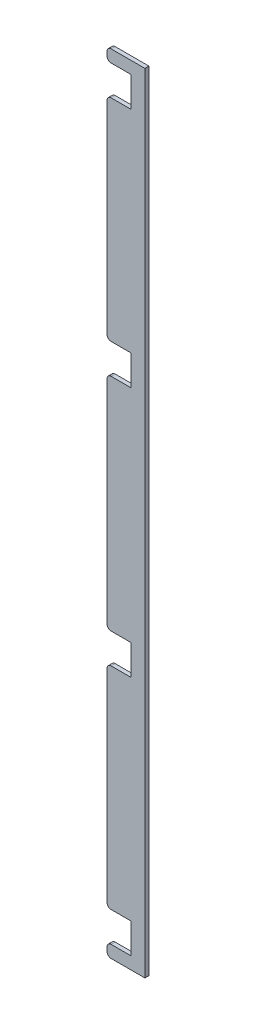
ISO-10303-21;
HEADER;
FILE_DESCRIPTION(('STEP AP214'),'2;1');
FILE_NAME('part.step','',(''),(''),'','','');
FILE_SCHEMA(('AUTOMOTIVE_DESIGN { 1 0 10303 214 1 1 1 1 }'));
ENDSEC;
DATA;
#1=APPLICATION_CONTEXT('core data for automotive mechanical design processes');
#2=APPLICATION_PROTOCOL_DEFINITION('international standard','automotive_design',2000,#1);
#3=PRODUCT_CONTEXT('',#1,'mechanical');
#4=PRODUCT('Part','Part','',(#3));
#5=PRODUCT_RELATED_PRODUCT_CATEGORY('part','',(#4));
#6=PRODUCT_DEFINITION_FORMATION('','',#4);
#7=PRODUCT_DEFINITION_CONTEXT('part definition',#1,'design');
#8=PRODUCT_DEFINITION('design','',#6,#7);
#9=PRODUCT_DEFINITION_SHAPE('','',#8);
#10=(LENGTH_UNIT() NAMED_UNIT(*) SI_UNIT(.MILLI.,.METRE.));
#11=(NAMED_UNIT(*) PLANE_ANGLE_UNIT() SI_UNIT($,.RADIAN.));
#12=(NAMED_UNIT(*) SI_UNIT($,.STERADIAN.) SOLID_ANGLE_UNIT());
#13=UNCERTAINTY_MEASURE_WITH_UNIT(LENGTH_MEASURE(1.E-05),#10,'distance_accuracy_value','');
#14=(GEOMETRIC_REPRESENTATION_CONTEXT(3) GLOBAL_UNCERTAINTY_ASSIGNED_CONTEXT((#13)) GLOBAL_UNIT_ASSIGNED_CONTEXT((#10,
#11,#12)) REPRESENTATION_CONTEXT('',''));
#15=CARTESIAN_POINT('',(0.,0.,0.));
#16=DIRECTION('',(0.,0.,1.));
#17=DIRECTION('',(1.,0.,0.));
#18=AXIS2_PLACEMENT_3D('',#15,#16,#17);
#19=CARTESIAN_POINT('',(-9.40000000000017,0.,1.));
#20=DIRECTION('',(1.,0.,0.));
#21=DIRECTION('',(0.,0.,-1.));
#22=AXIS2_PLACEMENT_3D('',#19,#20,#21);
#23=PLANE('',#22);
#24=DIRECTION('',(0.,-1.,0.));
#25=VECTOR('',#24,1.);
#26=CARTESIAN_POINT('',(-9.40000000000017,0.,0.));
#27=LINE('',#26,#25);
#28=CARTESIAN_POINT('',(-9.40000000000017,12.4047619047619,0.));
#29=VERTEX_POINT('',#28);
#30=CARTESIAN_POINT('',(-9.40000000000017,11.3547619047619,0.));
#31=VERTEX_POINT('',#30);
#32=EDGE_CURVE('E266',#29,#31,#27,.T.);
#33=ORIENTED_EDGE('',*,*,#32,.T.);
#34=DIRECTION('',(0.,0.,-1.));
#35=VECTOR('',#34,1.);
#36=CARTESIAN_POINT('',(-9.40000000000017,11.3547619047619,1.));
#37=LINE('',#36,#35);
#38=CARTESIAN_POINT('',(-9.40000000000017,11.3547619047619,1.));
#39=VERTEX_POINT('',#38);
#40=EDGE_CURVE('E11',#39,#31,#37,.T.);
#41=ORIENTED_EDGE('',*,*,#40,.F.);
#42=DIRECTION('',(0.,-1.,0.));
#43=VECTOR('',#42,1.);
#44=CARTESIAN_POINT('',(-9.40000000000017,0.,1.));
#45=LINE('',#44,#43);
#46=CARTESIAN_POINT('',(-9.40000000000017,12.4047619047619,1.));
#47=VERTEX_POINT('',#46);
#48=EDGE_CURVE('E325',#47,#39,#45,.T.);
#49=ORIENTED_EDGE('',*,*,#48,.F.);
#50=DIRECTION('',(0.,0.,-1.));
#51=VECTOR('',#50,1.);
#52=CARTESIAN_POINT('',(-9.40000000000017,12.4047619047619,1.));
#53=LINE('',#52,#51);
#54=EDGE_CURVE('E265',#47,#29,#53,.T.);
#55=ORIENTED_EDGE('',*,*,#54,.T.);
#56=EDGE_LOOP('',(#33,#41,#49,#55));
#57=FACE_BOUND('',#56,.T.);
#58=ADVANCED_FACE('F37',(#57),#23,.F.);
#59=CARTESIAN_POINT('',(-8.40000000000017,11.3547619047619,1.));
#60=DIRECTION('',(0.,0.,-1.));
#61=DIRECTION('',(-1.,0.,0.));
#62=AXIS2_PLACEMENT_3D('',#59,#60,#61);
#63=CYLINDRICAL_SURFACE('',#62,1.);
#64=CARTESIAN_POINT('',(-8.40000000000017,11.3547619047619,0.));
#65=DIRECTION('',(0.,0.,1.));
#66=DIRECTION('',(1.,0.,0.));
#67=AXIS2_PLACEMENT_3D('',#64,#65,#66);
#68=CIRCLE('',#67,1.);
#69=CARTESIAN_POINT('',(-8.40000000000018,10.3547619047619,0.));
#70=VERTEX_POINT('',#69);
#71=EDGE_CURVE('E269',#31,#70,#68,.T.);
#72=ORIENTED_EDGE('',*,*,#71,.T.);
#73=DIRECTION('',(0.,0.,-1.));
#74=VECTOR('',#73,1.);
#75=CARTESIAN_POINT('',(-8.40000000000018,10.3547619047619,1.));
#76=LINE('',#75,#74);
#77=CARTESIAN_POINT('',(-8.40000000000018,10.3547619047619,1.));
#78=VERTEX_POINT('',#77);
#79=EDGE_CURVE('E45',#78,#70,#76,.T.);
#80=ORIENTED_EDGE('',*,*,#79,.F.);
#81=CARTESIAN_POINT('',(-8.40000000000017,11.3547619047619,1.));
#82=DIRECTION('',(0.,0.,1.));
#83=DIRECTION('',(1.,0.,0.));
#84=AXIS2_PLACEMENT_3D('',#81,#82,#83);
#85=CIRCLE('',#84,1.);
#86=EDGE_CURVE('E161',#39,#78,#85,.T.);
#87=ORIENTED_EDGE('',*,*,#86,.F.);
#88=ORIENTED_EDGE('',*,*,#40,.T.);
#89=EDGE_LOOP('',(#72,#80,#87,#88));
#90=FACE_BOUND('',#89,.T.);
#91=ADVANCED_FACE('F491',(#90),#63,.T.);
#92=CARTESIAN_POINT('',(0.,10.3547619047619,1.));
#93=DIRECTION('',(0.,1.,0.));
#94=DIRECTION('',(-1.,0.,0.));
#95=AXIS2_PLACEMENT_3D('',#92,#93,#94);
#96=PLANE('',#95);
#97=DIRECTION('',(1.,0.,0.));
#98=VECTOR('',#97,1.);
#99=CARTESIAN_POINT('',(0.,10.3547619047619,0.));
#100=LINE('',#99,#98);
#101=CARTESIAN_POINT('',(-3.50000000000004,10.3547619047619,0.));
#102=VERTEX_POINT('',#101);
#103=EDGE_CURVE('E271',#70,#102,#100,.T.);
#104=ORIENTED_EDGE('',*,*,#103,.T.);
#105=DIRECTION('',(0.,0.,-1.));
#106=VECTOR('',#105,1.);
#107=CARTESIAN_POINT('',(-3.50000000000004,10.3547619047619,1.));
#108=LINE('',#107,#106);
#109=CARTESIAN_POINT('',(-3.50000000000004,10.3547619047619,1.));
#110=VERTEX_POINT('',#109);
#111=EDGE_CURVE('E398',#110,#102,#108,.T.);
#112=ORIENTED_EDGE('',*,*,#111,.F.);
#113=DIRECTION('',(1.,0.,0.));
#114=VECTOR('',#113,1.);
#115=CARTESIAN_POINT('',(0.,10.3547619047619,1.));
#116=LINE('',#115,#114);
#117=EDGE_CURVE('E406',#78,#110,#116,.T.);
#118=ORIENTED_EDGE('',*,*,#117,.F.);
#119=ORIENTED_EDGE('',*,*,#79,.T.);
#120=EDGE_LOOP('',(#104,#112,#118,#119));
#121=FACE_BOUND('',#120,.T.);
#122=ADVANCED_FACE('F404',(#121),#96,.F.);
#123=CARTESIAN_POINT('',(-3.50000000000004,0.,1.));
#124=DIRECTION('',(1.,0.,0.));
#125=DIRECTION('',(0.,1.,0.));
#126=AXIS2_PLACEMENT_3D('',#123,#124,#125);
#127=PLANE('',#126);
#128=DIRECTION('',(0.,-1.,0.));
#129=VECTOR('',#128,1.);
#130=CARTESIAN_POINT('',(-3.50000000000004,0.,0.));
#131=LINE('',#130,#129);
#132=CARTESIAN_POINT('',(-3.50000000000004,2.85476190476189,0.));
#133=VERTEX_POINT('',#132);
#134=EDGE_CURVE('E273',#102,#133,#131,.T.);
#135=ORIENTED_EDGE('',*,*,#134,.T.);
#136=DIRECTION('',(0.,0.,-1.));
#137=VECTOR('',#136,1.);
#138=CARTESIAN_POINT('',(-3.50000000000004,2.85476190476189,1.));
#139=LINE('',#138,#137);
#140=CARTESIAN_POINT('',(-3.50000000000004,2.85476190476189,1.));
#141=VERTEX_POINT('',#140);
#142=EDGE_CURVE('E395',#141,#133,#139,.T.);
#143=ORIENTED_EDGE('',*,*,#142,.F.);
#144=DIRECTION('',(0.,-1.,0.));
#145=VECTOR('',#144,1.);
#146=CARTESIAN_POINT('',(-3.50000000000004,0.,1.));
#147=LINE('',#146,#145);
#148=EDGE_CURVE('E424',#110,#141,#147,.T.);
#149=ORIENTED_EDGE('',*,*,#148,.F.);
#150=ORIENTED_EDGE('',*,*,#111,.T.);
#151=EDGE_LOOP('',(#135,#143,#149,#150));
#152=FACE_BOUND('',#151,.T.);
#153=ADVANCED_FACE('F415',(#152),#127,.F.);
#154=CARTESIAN_POINT('',(0.,2.85476190476194,1.));
#155=DIRECTION('',(0.,-1.,0.));
#156=DIRECTION('',(1.,0.,0.));
#157=AXIS2_PLACEMENT_3D('',#154,#155,#156);
#158=PLANE('',#157);
#159=DIRECTION('',(-1.,0.,0.));
#160=VECTOR('',#159,1.);
#161=CARTESIAN_POINT('',(0.,2.85476190476194,0.));
#162=LINE('',#161,#160);
#163=CARTESIAN_POINT('',(-8.40000000000016,2.85476190476189,0.));
#164=VERTEX_POINT('',#163);
#165=EDGE_CURVE('E275',#133,#164,#162,.T.);
#166=ORIENTED_EDGE('',*,*,#165,.T.);
#167=DIRECTION('',(0.,0.,-1.));
#168=VECTOR('',#167,1.);
#169=CARTESIAN_POINT('',(-8.40000000000016,2.85476190476189,1.));
#170=LINE('',#169,#168);
#171=CARTESIAN_POINT('',(-8.40000000000016,2.85476190476189,1.));
#172=VERTEX_POINT('',#171);
#173=EDGE_CURVE('E392',#172,#164,#170,.T.);
#174=ORIENTED_EDGE('',*,*,#173,.F.);
#175=DIRECTION('',(-1.,0.,0.));
#176=VECTOR('',#175,1.);
#177=CARTESIAN_POINT('',(0.,2.85476190476194,1.));
#178=LINE('',#177,#176);
#179=EDGE_CURVE('E421',#141,#172,#178,.T.);
#180=ORIENTED_EDGE('',*,*,#179,.F.);
#181=ORIENTED_EDGE('',*,*,#142,.T.);
#182=EDGE_LOOP('',(#166,#174,#180,#181));
#183=FACE_BOUND('',#182,.T.);
#184=ADVANCED_FACE('F419',(#183),#158,.F.);
#185=CARTESIAN_POINT('',(-8.40000000000017,1.85476190476189,1.));
#186=DIRECTION('',(0.,0.,-1.));
#187=DIRECTION('',(-1.,0.,0.));
#188=AXIS2_PLACEMENT_3D('',#185,#186,#187);
#189=CYLINDRICAL_SURFACE('',#188,1.);
#190=CARTESIAN_POINT('',(-8.40000000000017,1.85476190476189,0.));
#191=DIRECTION('',(0.,0.,1.));
#192=DIRECTION('',(1.,0.,0.));
#193=AXIS2_PLACEMENT_3D('',#190,#191,#192);
#194=CIRCLE('',#193,1.);
#195=CARTESIAN_POINT('',(-9.40000000000017,1.85476190476189,0.));
#196=VERTEX_POINT('',#195);
#197=EDGE_CURVE('E277',#164,#196,#194,.T.);
#198=ORIENTED_EDGE('',*,*,#197,.T.);
#199=DIRECTION('',(0.,0.,-1.));
#200=VECTOR('',#199,1.);
#201=CARTESIAN_POINT('',(-9.40000000000017,1.85476190476189,1.));
#202=LINE('',#201,#200);
#203=CARTESIAN_POINT('',(-9.40000000000017,1.85476190476189,1.));
#204=VERTEX_POINT('',#203);
#205=EDGE_CURVE('E389',#204,#196,#202,.T.);
#206=ORIENTED_EDGE('',*,*,#205,.F.);
#207=CARTESIAN_POINT('',(-8.40000000000017,1.85476190476189,1.));
#208=DIRECTION('',(0.,0.,1.));
#209=DIRECTION('',(1.,0.,0.));
#210=AXIS2_PLACEMENT_3D('',#207,#208,#209);
#211=CIRCLE('',#210,1.);
#212=EDGE_CURVE('E423',#172,#204,#211,.T.);
#213=ORIENTED_EDGE('',*,*,#212,.F.);
#214=ORIENTED_EDGE('',*,*,#173,.T.);
#215=EDGE_LOOP('',(#198,#206,#213,#214));
#216=FACE_BOUND('',#215,.T.);
#217=ADVANCED_FACE('F504',(#216),#189,.T.);
#218=CARTESIAN_POINT('',(-9.40000000000017,0.,1.));
#219=DIRECTION('',(1.,0.,0.));
#220=DIRECTION('',(0.,0.,-1.));
#221=AXIS2_PLACEMENT_3D('',#218,#219,#220);
#222=PLANE('',#221);
#223=DIRECTION('',(0.,-1.,0.));
#224=VECTOR('',#223,1.);
#225=CARTESIAN_POINT('',(-9.40000000000017,0.,0.));
#226=LINE('',#225,#224);
#227=CARTESIAN_POINT('',(-9.40000000000017,-48.6452380952381,0.));
#228=VERTEX_POINT('',#227);
#229=EDGE_CURVE('E279',#196,#228,#226,.T.);
#230=ORIENTED_EDGE('',*,*,#229,.T.);
#231=DIRECTION('',(0.,0.,-1.));
#232=VECTOR('',#231,1.);
#233=CARTESIAN_POINT('',(-9.40000000000017,-48.6452380952381,1.));
#234=LINE('',#233,#232);
#235=CARTESIAN_POINT('',(-9.40000000000017,-48.6452380952381,1.));
#236=VERTEX_POINT('',#235);
#237=EDGE_CURVE('E386',#236,#228,#234,.T.);
#238=ORIENTED_EDGE('',*,*,#237,.F.);
#239=DIRECTION('',(0.,-1.,0.));
#240=VECTOR('',#239,1.);
#241=CARTESIAN_POINT('',(-9.40000000000017,0.,1.));
#242=LINE('',#241,#240);
#243=EDGE_CURVE('E426',#204,#236,#242,.T.);
#244=ORIENTED_EDGE('',*,*,#243,.F.);
#245=ORIENTED_EDGE('',*,*,#205,.T.);
#246=EDGE_LOOP('',(#230,#238,#244,#245));
#247=FACE_BOUND('',#246,.T.);
#248=ADVANCED_FACE('F507',(#247),#222,.F.);
#249=CARTESIAN_POINT('',(-8.40000000000017,-48.6452380952381,1.));
#250=DIRECTION('',(0.,0.,-1.));
#251=DIRECTION('',(-1.,0.,0.));
#252=AXIS2_PLACEMENT_3D('',#249,#250,#251);
#253=CYLINDRICAL_SURFACE('',#252,1.);
#254=CARTESIAN_POINT('',(-8.40000000000017,-48.6452380952381,0.));
#255=DIRECTION('',(0.,0.,1.));
#256=DIRECTION('',(1.,0.,0.));
#257=AXIS2_PLACEMENT_3D('',#254,#255,#256);
#258=CIRCLE('',#257,1.);
#259=CARTESIAN_POINT('',(-8.40000000000018,-49.6452380952381,0.));
#260=VERTEX_POINT('',#259);
#261=EDGE_CURVE('E281',#228,#260,#258,.T.);
#262=ORIENTED_EDGE('',*,*,#261,.T.);
#263=DIRECTION('',(0.,0.,-1.));
#264=VECTOR('',#263,1.);
#265=CARTESIAN_POINT('',(-8.40000000000018,-49.6452380952381,1.));
#266=LINE('',#265,#264);
#267=CARTESIAN_POINT('',(-8.40000000000018,-49.6452380952381,1.));
#268=VERTEX_POINT('',#267);
#269=EDGE_CURVE('E383',#268,#260,#266,.T.);
#270=ORIENTED_EDGE('',*,*,#269,.F.);
#271=CARTESIAN_POINT('',(-8.40000000000017,-48.6452380952381,1.));
#272=DIRECTION('',(0.,0.,1.));
#273=DIRECTION('',(1.,0.,0.));
#274=AXIS2_PLACEMENT_3D('',#271,#272,#273);
#275=CIRCLE('',#274,1.);
#276=EDGE_CURVE('E432',#236,#268,#275,.T.);
#277=ORIENTED_EDGE('',*,*,#276,.F.);
#278=ORIENTED_EDGE('',*,*,#237,.T.);
#279=EDGE_LOOP('',(#262,#270,#277,#278));
#280=FACE_BOUND('',#279,.T.);
#281=ADVANCED_FACE('F511',(#280),#253,.T.);
#282=CARTESIAN_POINT('',(0.,-49.6452380952381,1.));
#283=DIRECTION('',(0.,1.,0.));
#284=DIRECTION('',(-1.,0.,0.));
#285=AXIS2_PLACEMENT_3D('',#282,#283,#284);
#286=PLANE('',#285);
#287=DIRECTION('',(1.,0.,0.));
#288=VECTOR('',#287,1.);
#289=CARTESIAN_POINT('',(0.,-49.6452380952381,0.));
#290=LINE('',#289,#288);
#291=CARTESIAN_POINT('',(-3.50000000000003,-49.6452380952381,0.));
#292=VERTEX_POINT('',#291);
#293=EDGE_CURVE('E283',#260,#292,#290,.T.);
#294=ORIENTED_EDGE('',*,*,#293,.T.);
#295=DIRECTION('',(0.,0.,-1.));
#296=VECTOR('',#295,1.);
#297=CARTESIAN_POINT('',(-3.50000000000003,-49.6452380952381,1.));
#298=LINE('',#297,#296);
#299=CARTESIAN_POINT('',(-3.50000000000003,-49.6452380952381,1.));
#300=VERTEX_POINT('',#299);
#301=EDGE_CURVE('E380',#300,#292,#298,.T.);
#302=ORIENTED_EDGE('',*,*,#301,.F.);
#303=DIRECTION('',(1.,0.,0.));
#304=VECTOR('',#303,1.);
#305=CARTESIAN_POINT('',(0.,-49.6452380952381,1.));
#306=LINE('',#305,#304);
#307=EDGE_CURVE('E434',#268,#300,#306,.T.);
#308=ORIENTED_EDGE('',*,*,#307,.F.);
#309=ORIENTED_EDGE('',*,*,#269,.T.);
#310=EDGE_LOOP('',(#294,#302,#308,#309));
#311=FACE_BOUND('',#310,.T.);
#312=ADVANCED_FACE('F515',(#311),#286,.F.);
#313=CARTESIAN_POINT('',(-3.50000000000004,0.,1.));
#314=DIRECTION('',(1.,0.,0.));
#315=DIRECTION('',(0.,1.,0.));
#316=AXIS2_PLACEMENT_3D('',#313,#314,#315);
#317=PLANE('',#316);
#318=DIRECTION('',(0.,-1.,0.));
#319=VECTOR('',#318,1.);
#320=CARTESIAN_POINT('',(-3.50000000000004,0.,0.));
#321=LINE('',#320,#319);
#322=CARTESIAN_POINT('',(-3.50000000000003,-57.1452380952381,0.));
#323=VERTEX_POINT('',#322);
#324=EDGE_CURVE('E285',#292,#323,#321,.T.);
#325=ORIENTED_EDGE('',*,*,#324,.T.);
#326=DIRECTION('',(0.,0.,-1.));
#327=VECTOR('',#326,1.);
#328=CARTESIAN_POINT('',(-3.50000000000003,-57.1452380952381,1.));
#329=LINE('',#328,#327);
#330=CARTESIAN_POINT('',(-3.50000000000003,-57.1452380952381,1.));
#331=VERTEX_POINT('',#330);
#332=EDGE_CURVE('E377',#331,#323,#329,.T.);
#333=ORIENTED_EDGE('',*,*,#332,.F.);
#334=DIRECTION('',(0.,-1.,0.));
#335=VECTOR('',#334,1.);
#336=CARTESIAN_POINT('',(-3.50000000000004,0.,1.));
#337=LINE('',#336,#335);
#338=EDGE_CURVE('E436',#300,#331,#337,.T.);
#339=ORIENTED_EDGE('',*,*,#338,.F.);
#340=ORIENTED_EDGE('',*,*,#301,.T.);
#341=EDGE_LOOP('',(#325,#333,#339,#340));
#342=FACE_BOUND('',#341,.T.);
#343=ADVANCED_FACE('F519',(#342),#317,.F.);
#344=CARTESIAN_POINT('',(3.96524744256675E-13,-57.1452380952381,1.));
#345=DIRECTION('',(0.,-1.,0.));
#346=DIRECTION('',(1.,0.,0.));
#347=AXIS2_PLACEMENT_3D('',#344,#345,#346);
#348=PLANE('',#347);
#349=DIRECTION('',(-1.,0.,0.));
#350=VECTOR('',#349,1.);
#351=CARTESIAN_POINT('',(3.96524744256675E-13,-57.1452380952381,0.));
#352=LINE('',#351,#350);
#353=CARTESIAN_POINT('',(-8.40000000000016,-57.1452380952381,0.));
#354=VERTEX_POINT('',#353);
#355=EDGE_CURVE('E287',#323,#354,#352,.T.);
#356=ORIENTED_EDGE('',*,*,#355,.T.);
#357=DIRECTION('',(0.,0.,-1.));
#358=VECTOR('',#357,1.);
#359=CARTESIAN_POINT('',(-8.40000000000016,-57.1452380952381,1.));
#360=LINE('',#359,#358);
#361=CARTESIAN_POINT('',(-8.40000000000016,-57.1452380952381,1.));
#362=VERTEX_POINT('',#361);
#363=EDGE_CURVE('E374',#362,#354,#360,.T.);
#364=ORIENTED_EDGE('',*,*,#363,.F.);
#365=DIRECTION('',(-1.,0.,0.));
#366=VECTOR('',#365,1.);
#367=CARTESIAN_POINT('',(3.96524744256675E-13,-57.1452380952381,1.));
#368=LINE('',#367,#366);
#369=EDGE_CURVE('E438',#331,#362,#368,.T.);
#370=ORIENTED_EDGE('',*,*,#369,.F.);
#371=ORIENTED_EDGE('',*,*,#332,.T.);
#372=EDGE_LOOP('',(#356,#364,#370,#371));
#373=FACE_BOUND('',#372,.T.);
#374=ADVANCED_FACE('F523',(#373),#348,.F.);
#375=CARTESIAN_POINT('',(-8.40000000000017,-58.1452380952381,1.));
#376=DIRECTION('',(0.,0.,-1.));
#377=DIRECTION('',(-1.,0.,0.));
#378=AXIS2_PLACEMENT_3D('',#375,#376,#377);
#379=CYLINDRICAL_SURFACE('',#378,1.);
#380=CARTESIAN_POINT('',(-8.40000000000017,-58.1452380952381,0.));
#381=DIRECTION('',(0.,0.,1.));
#382=DIRECTION('',(1.,0.,0.));
#383=AXIS2_PLACEMENT_3D('',#380,#381,#382);
#384=CIRCLE('',#383,1.);
#385=CARTESIAN_POINT('',(-9.40000000000017,-58.1452380952381,0.));
#386=VERTEX_POINT('',#385);
#387=EDGE_CURVE('E289',#354,#386,#384,.T.);
#388=ORIENTED_EDGE('',*,*,#387,.T.);
#389=DIRECTION('',(0.,0.,-1.));
#390=VECTOR('',#389,1.);
#391=CARTESIAN_POINT('',(-9.40000000000017,-58.1452380952381,1.));
#392=LINE('',#391,#390);
#393=CARTESIAN_POINT('',(-9.40000000000017,-58.1452380952381,1.));
#394=VERTEX_POINT('',#393);
#395=EDGE_CURVE('E371',#394,#386,#392,.T.);
#396=ORIENTED_EDGE('',*,*,#395,.F.);
#397=CARTESIAN_POINT('',(-8.40000000000017,-58.1452380952381,1.));
#398=DIRECTION('',(0.,0.,1.));
#399=DIRECTION('',(1.,0.,0.));
#400=AXIS2_PLACEMENT_3D('',#397,#398,#399);
#401=CIRCLE('',#400,1.);
#402=EDGE_CURVE('E440',#362,#394,#401,.T.);
#403=ORIENTED_EDGE('',*,*,#402,.F.);
#404=ORIENTED_EDGE('',*,*,#363,.T.);
#405=EDGE_LOOP('',(#388,#396,#403,#404));
#406=FACE_BOUND('',#405,.T.);
#407=ADVANCED_FACE('F527',(#406),#379,.T.);
#408=CARTESIAN_POINT('',(-9.40000000000017,0.,1.));
#409=DIRECTION('',(1.,0.,0.));
#410=DIRECTION('',(0.,0.,-1.));
#411=AXIS2_PLACEMENT_3D('',#408,#409,#410);
#412=PLANE('',#411);
#413=DIRECTION('',(0.,-1.,0.));
#414=VECTOR('',#413,1.);
#415=CARTESIAN_POINT('',(-9.40000000000017,0.,0.));
#416=LINE('',#415,#414);
#417=CARTESIAN_POINT('',(-9.40000000000017,-111.045238095238,0.));
#418=VERTEX_POINT('',#417);
#419=EDGE_CURVE('E291',#386,#418,#416,.T.);
#420=ORIENTED_EDGE('',*,*,#419,.T.);
#421=DIRECTION('',(0.,0.,-1.));
#422=VECTOR('',#421,1.);
#423=CARTESIAN_POINT('',(-9.40000000000017,-111.045238095238,1.));
#424=LINE('',#423,#422);
#425=CARTESIAN_POINT('',(-9.40000000000017,-111.045238095238,1.));
#426=VERTEX_POINT('',#425);
#427=EDGE_CURVE('E368',#426,#418,#424,.T.);
#428=ORIENTED_EDGE('',*,*,#427,.F.);
#429=DIRECTION('',(0.,-1.,0.));
#430=VECTOR('',#429,1.);
#431=CARTESIAN_POINT('',(-9.40000000000017,0.,1.));
#432=LINE('',#431,#430);
#433=EDGE_CURVE('E442',#394,#426,#432,.T.);
#434=ORIENTED_EDGE('',*,*,#433,.F.);
#435=ORIENTED_EDGE('',*,*,#395,.T.);
#436=EDGE_LOOP('',(#420,#428,#434,#435));
#437=FACE_BOUND('',#436,.T.);
#438=ADVANCED_FACE('F531',(#437),#412,.F.);
#439=CARTESIAN_POINT('',(-8.40000000000017,-111.045238095238,1.));
#440=DIRECTION('',(0.,0.,-1.));
#441=DIRECTION('',(-1.,0.,0.));
#442=AXIS2_PLACEMENT_3D('',#439,#440,#441);
#443=CYLINDRICAL_SURFACE('',#442,1.);
#444=CARTESIAN_POINT('',(-8.40000000000017,-111.045238095238,0.));
#445=DIRECTION('',(0.,0.,1.));
#446=DIRECTION('',(1.,0.,0.));
#447=AXIS2_PLACEMENT_3D('',#444,#445,#446);
#448=CIRCLE('',#447,1.);
#449=CARTESIAN_POINT('',(-8.40000000000017,-112.045238095238,0.));
#450=VERTEX_POINT('',#449);
#451=EDGE_CURVE('E293',#418,#450,#448,.T.);
#452=ORIENTED_EDGE('',*,*,#451,.T.);
#453=DIRECTION('',(0.,0.,-1.));
#454=VECTOR('',#453,1.);
#455=CARTESIAN_POINT('',(-8.40000000000017,-112.045238095238,1.));
#456=LINE('',#455,#454);
#457=CARTESIAN_POINT('',(-8.40000000000017,-112.045238095238,1.));
#458=VERTEX_POINT('',#457);
#459=EDGE_CURVE('E365',#458,#450,#456,.T.);
#460=ORIENTED_EDGE('',*,*,#459,.F.);
#461=CARTESIAN_POINT('',(-8.40000000000017,-111.045238095238,1.));
#462=DIRECTION('',(0.,0.,1.));
#463=DIRECTION('',(1.,0.,0.));
#464=AXIS2_PLACEMENT_3D('',#461,#462,#463);
#465=CIRCLE('',#464,1.);
#466=EDGE_CURVE('E444',#426,#458,#465,.T.);
#467=ORIENTED_EDGE('',*,*,#466,.F.);
#468=ORIENTED_EDGE('',*,*,#427,.T.);
#469=EDGE_LOOP('',(#452,#460,#467,#468));
#470=FACE_BOUND('',#469,.T.);
#471=ADVANCED_FACE('F535',(#470),#443,.T.);
#472=CARTESIAN_POINT('',(3.98702574143949E-13,-112.045238095238,1.));
#473=DIRECTION('',(0.,1.,0.));
#474=DIRECTION('',(-1.,0.,0.));
#475=AXIS2_PLACEMENT_3D('',#472,#473,#474);
#476=PLANE('',#475);
#477=DIRECTION('',(1.,0.,0.));
#478=VECTOR('',#477,1.);
#479=CARTESIAN_POINT('',(3.98702574143949E-13,-112.045238095238,0.));
#480=LINE('',#479,#478);
#481=CARTESIAN_POINT('',(-3.50000000000003,-112.045238095238,0.));
#482=VERTEX_POINT('',#481);
#483=EDGE_CURVE('E295',#450,#482,#480,.T.);
#484=ORIENTED_EDGE('',*,*,#483,.T.);
#485=DIRECTION('',(0.,0.,-1.));
#486=VECTOR('',#485,1.);
#487=CARTESIAN_POINT('',(-3.50000000000003,-112.045238095238,1.));
#488=LINE('',#487,#486);
#489=CARTESIAN_POINT('',(-3.50000000000003,-112.045238095238,1.));
#490=VERTEX_POINT('',#489);
#491=EDGE_CURVE('E362',#490,#482,#488,.T.);
#492=ORIENTED_EDGE('',*,*,#491,.F.);
#493=DIRECTION('',(1.,0.,0.));
#494=VECTOR('',#493,1.);
#495=CARTESIAN_POINT('',(3.98702574143949E-13,-112.045238095238,1.));
#496=LINE('',#495,#494);
#497=EDGE_CURVE('E446',#458,#490,#496,.T.);
#498=ORIENTED_EDGE('',*,*,#497,.F.);
#499=ORIENTED_EDGE('',*,*,#459,.T.);
#500=EDGE_LOOP('',(#484,#492,#498,#499));
#501=FACE_BOUND('',#500,.T.);
#502=ADVANCED_FACE('F539',(#501),#476,.F.);
#503=CARTESIAN_POINT('',(-3.50000000000004,0.,1.));
#504=DIRECTION('',(1.,0.,0.));
#505=DIRECTION('',(0.,1.,0.));
#506=AXIS2_PLACEMENT_3D('',#503,#504,#505);
#507=PLANE('',#506);
#508=DIRECTION('',(0.,-1.,0.));
#509=VECTOR('',#508,1.);
#510=CARTESIAN_POINT('',(-3.50000000000004,0.,0.));
#511=LINE('',#510,#509);
#512=CARTESIAN_POINT('',(-3.50000000000002,-119.545238095238,0.));
#513=VERTEX_POINT('',#512);
#514=EDGE_CURVE('E297',#482,#513,#511,.T.);
#515=ORIENTED_EDGE('',*,*,#514,.T.);
#516=DIRECTION('',(0.,0.,-1.));
#517=VECTOR('',#516,1.);
#518=CARTESIAN_POINT('',(-3.50000000000002,-119.545238095238,1.));
#519=LINE('',#518,#517);
#520=CARTESIAN_POINT('',(-3.50000000000002,-119.545238095238,1.));
#521=VERTEX_POINT('',#520);
#522=EDGE_CURVE('E359',#521,#513,#519,.T.);
#523=ORIENTED_EDGE('',*,*,#522,.F.);
#524=DIRECTION('',(0.,-1.,0.));
#525=VECTOR('',#524,1.);
#526=CARTESIAN_POINT('',(-3.50000000000004,0.,1.));
#527=LINE('',#526,#525);
#528=EDGE_CURVE('E448',#490,#521,#527,.T.);
#529=ORIENTED_EDGE('',*,*,#528,.F.);
#530=ORIENTED_EDGE('',*,*,#491,.T.);
#531=EDGE_LOOP('',(#515,#523,#529,#530));
#532=FACE_BOUND('',#531,.T.);
#533=ADVANCED_FACE('F543',(#532),#507,.F.);
#534=CARTESIAN_POINT('',(0.,-119.545238095238,1.));
#535=DIRECTION('',(0.,-1.,0.));
#536=DIRECTION('',(0.,0.,-1.));
#537=AXIS2_PLACEMENT_3D('',#534,#535,#536);
#538=PLANE('',#537);
#539=DIRECTION('',(-1.,0.,0.));
#540=VECTOR('',#539,1.);
#541=CARTESIAN_POINT('',(0.,-119.545238095238,0.));
#542=LINE('',#541,#540);
#543=CARTESIAN_POINT('',(-8.40000000000017,-119.545238095238,0.));
#544=VERTEX_POINT('',#543);
#545=EDGE_CURVE('E299',#513,#544,#542,.T.);
#546=ORIENTED_EDGE('',*,*,#545,.T.);
#547=DIRECTION('',(0.,0.,-1.));
#548=VECTOR('',#547,1.);
#549=CARTESIAN_POINT('',(-8.40000000000017,-119.545238095238,1.));
#550=LINE('',#549,#548);
#551=CARTESIAN_POINT('',(-8.40000000000017,-119.545238095238,1.));
#552=VERTEX_POINT('',#551);
#553=EDGE_CURVE('E356',#552,#544,#550,.T.);
#554=ORIENTED_EDGE('',*,*,#553,.F.);
#555=DIRECTION('',(-1.,0.,0.));
#556=VECTOR('',#555,1.);
#557=CARTESIAN_POINT('',(0.,-119.545238095238,1.));
#558=LINE('',#557,#556);
#559=EDGE_CURVE('E450',#521,#552,#558,.T.);
#560=ORIENTED_EDGE('',*,*,#559,.F.);
#561=ORIENTED_EDGE('',*,*,#522,.T.);
#562=EDGE_LOOP('',(#546,#554,#560,#561));
#563=FACE_BOUND('',#562,.T.);
#564=ADVANCED_FACE('F547',(#563),#538,.F.);
#565=CARTESIAN_POINT('',(-8.40000000000017,-120.545238095238,1.));
#566=DIRECTION('',(0.,0.,-1.));
#567=DIRECTION('',(-1.,0.,0.));
#568=AXIS2_PLACEMENT_3D('',#565,#566,#567);
#569=CYLINDRICAL_SURFACE('',#568,1.);
#570=CARTESIAN_POINT('',(-8.40000000000017,-120.545238095238,0.));
#571=DIRECTION('',(0.,0.,1.));
#572=DIRECTION('',(1.,0.,0.));
#573=AXIS2_PLACEMENT_3D('',#570,#571,#572);
#574=CIRCLE('',#573,1.);
#575=CARTESIAN_POINT('',(-9.40000000000017,-120.545238095238,0.));
#576=VERTEX_POINT('',#575);
#577=EDGE_CURVE('E301',#544,#576,#574,.T.);
#578=ORIENTED_EDGE('',*,*,#577,.T.);
#579=DIRECTION('',(0.,0.,-1.));
#580=VECTOR('',#579,1.);
#581=CARTESIAN_POINT('',(-9.40000000000017,-120.545238095238,1.));
#582=LINE('',#581,#580);
#583=CARTESIAN_POINT('',(-9.40000000000017,-120.545238095238,1.));
#584=VERTEX_POINT('',#583);
#585=EDGE_CURVE('E353',#584,#576,#582,.T.);
#586=ORIENTED_EDGE('',*,*,#585,.F.);
#587=CARTESIAN_POINT('',(-8.40000000000017,-120.545238095238,1.));
#588=DIRECTION('',(0.,0.,1.));
#589=DIRECTION('',(1.,0.,0.));
#590=AXIS2_PLACEMENT_3D('',#587,#588,#589);
#591=CIRCLE('',#590,1.);
#592=EDGE_CURVE('E452',#552,#584,#591,.T.);
#593=ORIENTED_EDGE('',*,*,#592,.F.);
#594=ORIENTED_EDGE('',*,*,#553,.T.);
#595=EDGE_LOOP('',(#578,#586,#593,#594));
#596=FACE_BOUND('',#595,.T.);
#597=ADVANCED_FACE('F551',(#596),#569,.T.);
#598=CARTESIAN_POINT('',(-9.40000000000017,0.,1.));
#599=DIRECTION('',(1.,0.,0.));
#600=DIRECTION('',(0.,0.,-1.));
#601=AXIS2_PLACEMENT_3D('',#598,#599,#600);
#602=PLANE('',#601);
#603=DIRECTION('',(0.,-1.,0.));
#604=VECTOR('',#603,1.);
#605=CARTESIAN_POINT('',(-9.40000000000017,0.,0.));
#606=LINE('',#605,#604);
#607=CARTESIAN_POINT('',(-9.40000000000017,-171.045238095238,0.));
#608=VERTEX_POINT('',#607);
#609=EDGE_CURVE('E303',#576,#608,#606,.T.);
#610=ORIENTED_EDGE('',*,*,#609,.T.);
#611=DIRECTION('',(0.,0.,-1.));
#612=VECTOR('',#611,1.);
#613=CARTESIAN_POINT('',(-9.40000000000017,-171.045238095238,1.));
#614=LINE('',#613,#612);
#615=CARTESIAN_POINT('',(-9.40000000000017,-171.045238095238,1.));
#616=VERTEX_POINT('',#615);
#617=EDGE_CURVE('E350',#616,#608,#614,.T.);
#618=ORIENTED_EDGE('',*,*,#617,.F.);
#619=DIRECTION('',(0.,-1.,0.));
#620=VECTOR('',#619,1.);
#621=CARTESIAN_POINT('',(-9.40000000000017,0.,1.));
#622=LINE('',#621,#620);
#623=EDGE_CURVE('E454',#584,#616,#622,.T.);
#624=ORIENTED_EDGE('',*,*,#623,.F.);
#625=ORIENTED_EDGE('',*,*,#585,.T.);
#626=EDGE_LOOP('',(#610,#618,#624,#625));
#627=FACE_BOUND('',#626,.T.);
#628=ADVANCED_FACE('F555',(#627),#602,.F.);
#629=CARTESIAN_POINT('',(-8.40000000000017,-171.045238095238,1.));
#630=DIRECTION('',(0.,0.,-1.));
#631=DIRECTION('',(-1.,0.,0.));
#632=AXIS2_PLACEMENT_3D('',#629,#630,#631);
#633=CYLINDRICAL_SURFACE('',#632,1.);
#634=CARTESIAN_POINT('',(-8.40000000000017,-171.045238095238,0.));
#635=DIRECTION('',(0.,0.,1.));
#636=DIRECTION('',(1.,0.,0.));
#637=AXIS2_PLACEMENT_3D('',#634,#635,#636);
#638=CIRCLE('',#637,1.);
#639=CARTESIAN_POINT('',(-8.40000000000017,-172.045238095238,0.));
#640=VERTEX_POINT('',#639);
#641=EDGE_CURVE('E305',#608,#640,#638,.T.);
#642=ORIENTED_EDGE('',*,*,#641,.T.);
#643=DIRECTION('',(0.,0.,-1.));
#644=VECTOR('',#643,1.);
#645=CARTESIAN_POINT('',(-8.40000000000017,-172.045238095238,1.));
#646=LINE('',#645,#644);
#647=CARTESIAN_POINT('',(-8.40000000000017,-172.045238095238,1.));
#648=VERTEX_POINT('',#647);
#649=EDGE_CURVE('E347',#648,#640,#646,.T.);
#650=ORIENTED_EDGE('',*,*,#649,.F.);
#651=CARTESIAN_POINT('',(-8.40000000000017,-171.045238095238,1.));
#652=DIRECTION('',(0.,0.,1.));
#653=DIRECTION('',(1.,0.,0.));
#654=AXIS2_PLACEMENT_3D('',#651,#652,#653);
#655=CIRCLE('',#654,1.);
#656=EDGE_CURVE('E456',#616,#648,#655,.T.);
#657=ORIENTED_EDGE('',*,*,#656,.F.);
#658=ORIENTED_EDGE('',*,*,#617,.T.);
#659=EDGE_LOOP('',(#642,#650,#657,#658));
#660=FACE_BOUND('',#659,.T.);
#661=ADVANCED_FACE('F559',(#660),#633,.T.);
#662=CARTESIAN_POINT('',(0.,-172.045238095238,1.));
#663=DIRECTION('',(0.,1.,0.));
#664=DIRECTION('',(0.,0.,1.));
#665=AXIS2_PLACEMENT_3D('',#662,#663,#664);
#666=PLANE('',#665);
#667=DIRECTION('',(1.,0.,0.));
#668=VECTOR('',#667,1.);
#669=CARTESIAN_POINT('',(0.,-172.045238095238,0.));
#670=LINE('',#669,#668);
#671=CARTESIAN_POINT('',(-3.50000000000002,-172.045238095238,0.));
#672=VERTEX_POINT('',#671);
#673=EDGE_CURVE('E307',#640,#672,#670,.T.);
#674=ORIENTED_EDGE('',*,*,#673,.T.);
#675=DIRECTION('',(0.,0.,-1.));
#676=VECTOR('',#675,1.);
#677=CARTESIAN_POINT('',(-3.50000000000002,-172.045238095238,1.));
#678=LINE('',#677,#676);
#679=CARTESIAN_POINT('',(-3.50000000000002,-172.045238095238,1.));
#680=VERTEX_POINT('',#679);
#681=EDGE_CURVE('E344',#680,#672,#678,.T.);
#682=ORIENTED_EDGE('',*,*,#681,.F.);
#683=DIRECTION('',(1.,0.,0.));
#684=VECTOR('',#683,1.);
#685=CARTESIAN_POINT('',(0.,-172.045238095238,1.));
#686=LINE('',#685,#684);
#687=EDGE_CURVE('E458',#648,#680,#686,.T.);
#688=ORIENTED_EDGE('',*,*,#687,.F.);
#689=ORIENTED_EDGE('',*,*,#649,.T.);
#690=EDGE_LOOP('',(#674,#682,#688,#689));
#691=FACE_BOUND('',#690,.T.);
#692=ADVANCED_FACE('F563',(#691),#666,.F.);
#693=CARTESIAN_POINT('',(-3.50000000000004,0.,1.));
#694=DIRECTION('',(1.,0.,0.));
#695=DIRECTION('',(0.,1.,0.));
#696=AXIS2_PLACEMENT_3D('',#693,#694,#695);
#697=PLANE('',#696);
#698=DIRECTION('',(0.,-1.,0.));
#699=VECTOR('',#698,1.);
#700=CARTESIAN_POINT('',(-3.50000000000004,0.,0.));
#701=LINE('',#700,#699);
#702=CARTESIAN_POINT('',(-3.50000000000002,-179.545238095238,0.));
#703=VERTEX_POINT('',#702);
#704=EDGE_CURVE('E309',#672,#703,#701,.T.);
#705=ORIENTED_EDGE('',*,*,#704,.T.);
#706=DIRECTION('',(0.,0.,-1.));
#707=VECTOR('',#706,1.);
#708=CARTESIAN_POINT('',(-3.50000000000002,-179.545238095238,1.));
#709=LINE('',#708,#707);
#710=CARTESIAN_POINT('',(-3.50000000000002,-179.545238095238,1.));
#711=VERTEX_POINT('',#710);
#712=EDGE_CURVE('E341',#711,#703,#709,.T.);
#713=ORIENTED_EDGE('',*,*,#712,.F.);
#714=DIRECTION('',(0.,-1.,0.));
#715=VECTOR('',#714,1.);
#716=CARTESIAN_POINT('',(-3.50000000000004,0.,1.));
#717=LINE('',#716,#715);
#718=EDGE_CURVE('E460',#680,#711,#717,.T.);
#719=ORIENTED_EDGE('',*,*,#718,.F.);
#720=ORIENTED_EDGE('',*,*,#681,.T.);
#721=EDGE_LOOP('',(#705,#713,#719,#720));
#722=FACE_BOUND('',#721,.T.);
#723=ADVANCED_FACE('F567',(#722),#697,.F.);
#724=CARTESIAN_POINT('',(0.,-179.545238095238,1.));
#725=DIRECTION('',(0.,-1.,0.));
#726=DIRECTION('',(0.,0.,-1.));
#727=AXIS2_PLACEMENT_3D('',#724,#725,#726);
#728=PLANE('',#727);
#729=DIRECTION('',(-1.,0.,0.));
#730=VECTOR('',#729,1.);
#731=CARTESIAN_POINT('',(0.,-179.545238095238,0.));
#732=LINE('',#731,#730);
#733=CARTESIAN_POINT('',(-8.40000000000017,-179.545238095238,0.));
#734=VERTEX_POINT('',#733);
#735=EDGE_CURVE('E311',#703,#734,#732,.T.);
#736=ORIENTED_EDGE('',*,*,#735,.T.);
#737=DIRECTION('',(0.,0.,-1.));
#738=VECTOR('',#737,1.);
#739=CARTESIAN_POINT('',(-8.40000000000017,-179.545238095238,1.));
#740=LINE('',#739,#738);
#741=CARTESIAN_POINT('',(-8.40000000000017,-179.545238095238,1.));
#742=VERTEX_POINT('',#741);
#743=EDGE_CURVE('E338',#742,#734,#740,.T.);
#744=ORIENTED_EDGE('',*,*,#743,.F.);
#745=DIRECTION('',(-1.,0.,0.));
#746=VECTOR('',#745,1.);
#747=CARTESIAN_POINT('',(0.,-179.545238095238,1.));
#748=LINE('',#747,#746);
#749=EDGE_CURVE('E462',#711,#742,#748,.T.);
#750=ORIENTED_EDGE('',*,*,#749,.F.);
#751=ORIENTED_EDGE('',*,*,#712,.T.);
#752=EDGE_LOOP('',(#736,#744,#750,#751));
#753=FACE_BOUND('',#752,.T.);
#754=ADVANCED_FACE('F571',(#753),#728,.F.);
#755=CARTESIAN_POINT('',(-8.40000000000017,-180.545238095238,1.));
#756=DIRECTION('',(0.,0.,-1.));
#757=DIRECTION('',(-1.,0.,0.));
#758=AXIS2_PLACEMENT_3D('',#755,#756,#757);
#759=CYLINDRICAL_SURFACE('',#758,1.);
#760=CARTESIAN_POINT('',(-8.40000000000017,-180.545238095238,0.));
#761=DIRECTION('',(0.,0.,1.));
#762=DIRECTION('',(1.,0.,0.));
#763=AXIS2_PLACEMENT_3D('',#760,#761,#762);
#764=CIRCLE('',#763,1.);
#765=CARTESIAN_POINT('',(-9.40000000000017,-180.545238095238,0.));
#766=VERTEX_POINT('',#765);
#767=EDGE_CURVE('E313',#734,#766,#764,.T.);
#768=ORIENTED_EDGE('',*,*,#767,.T.);
#769=DIRECTION('',(0.,0.,-1.));
#770=VECTOR('',#769,1.);
#771=CARTESIAN_POINT('',(-9.40000000000017,-180.545238095238,1.));
#772=LINE('',#771,#770);
#773=CARTESIAN_POINT('',(-9.40000000000017,-180.545238095238,1.));
#774=VERTEX_POINT('',#773);
#775=EDGE_CURVE('E335',#774,#766,#772,.T.);
#776=ORIENTED_EDGE('',*,*,#775,.F.);
#777=CARTESIAN_POINT('',(-8.40000000000017,-180.545238095238,1.));
#778=DIRECTION('',(0.,0.,1.));
#779=DIRECTION('',(1.,0.,0.));
#780=AXIS2_PLACEMENT_3D('',#777,#778,#779);
#781=CIRCLE('',#780,1.);
#782=EDGE_CURVE('E464',#742,#774,#781,.T.);
#783=ORIENTED_EDGE('',*,*,#782,.F.);
#784=ORIENTED_EDGE('',*,*,#743,.T.);
#785=EDGE_LOOP('',(#768,#776,#783,#784));
#786=FACE_BOUND('',#785,.T.);
#787=ADVANCED_FACE('F575',(#786),#759,.T.);
#788=CARTESIAN_POINT('',(-9.40000000000017,0.,1.));
#789=DIRECTION('',(1.,0.,0.));
#790=DIRECTION('',(0.,0.,-1.));
#791=AXIS2_PLACEMENT_3D('',#788,#789,#790);
#792=PLANE('',#791);
#793=DIRECTION('',(0.,-1.,0.));
#794=VECTOR('',#793,1.);
#795=CARTESIAN_POINT('',(-9.40000000000017,0.,0.));
#796=LINE('',#795,#794);
#797=CARTESIAN_POINT('',(-9.40000000000017,-181.595238095238,0.));
#798=VERTEX_POINT('',#797);
#799=EDGE_CURVE('E315',#766,#798,#796,.T.);
#800=ORIENTED_EDGE('',*,*,#799,.T.);
#801=DIRECTION('',(0.,0.,-1.));
#802=VECTOR('',#801,1.);
#803=CARTESIAN_POINT('',(-9.40000000000017,-181.595238095238,1.));
#804=LINE('',#803,#802);
#805=CARTESIAN_POINT('',(-9.40000000000017,-181.595238095238,1.));
#806=VERTEX_POINT('',#805);
#807=EDGE_CURVE('E332',#806,#798,#804,.T.);
#808=ORIENTED_EDGE('',*,*,#807,.F.);
#809=DIRECTION('',(0.,-1.,0.));
#810=VECTOR('',#809,1.);
#811=CARTESIAN_POINT('',(-9.40000000000017,0.,1.));
#812=LINE('',#811,#810);
#813=EDGE_CURVE('E466',#774,#806,#812,.T.);
#814=ORIENTED_EDGE('',*,*,#813,.F.);
#815=ORIENTED_EDGE('',*,*,#775,.T.);
#816=EDGE_LOOP('',(#800,#808,#814,#815));
#817=FACE_BOUND('',#816,.T.);
#818=ADVANCED_FACE('F579',(#817),#792,.F.);
#819=CARTESIAN_POINT('',(-8.40000000000017,-181.595238095238,1.));
#820=DIRECTION('',(0.,0.,-1.));
#821=DIRECTION('',(-1.,0.,0.));
#822=AXIS2_PLACEMENT_3D('',#819,#820,#821);
#823=CYLINDRICAL_SURFACE('',#822,1.);
#824=CARTESIAN_POINT('',(-8.40000000000017,-181.595238095238,0.));
#825=DIRECTION('',(0.,0.,1.));
#826=DIRECTION('',(1.,0.,0.));
#827=AXIS2_PLACEMENT_3D('',#824,#825,#826);
#828=CIRCLE('',#827,1.);
#829=CARTESIAN_POINT('',(-8.40000000000017,-182.595238095238,0.));
#830=VERTEX_POINT('',#829);
#831=EDGE_CURVE('E317',#798,#830,#828,.T.);
#832=ORIENTED_EDGE('',*,*,#831,.T.);
#833=DIRECTION('',(0.,0.,-1.));
#834=VECTOR('',#833,1.);
#835=CARTESIAN_POINT('',(-8.40000000000017,-182.595238095238,1.));
#836=LINE('',#835,#834);
#837=CARTESIAN_POINT('',(-8.40000000000017,-182.595238095238,1.));
#838=VERTEX_POINT('',#837);
#839=EDGE_CURVE('E329',#838,#830,#836,.T.);
#840=ORIENTED_EDGE('',*,*,#839,.F.);
#841=CARTESIAN_POINT('',(-8.40000000000017,-181.595238095238,1.));
#842=DIRECTION('',(0.,0.,1.));
#843=DIRECTION('',(1.,0.,0.));
#844=AXIS2_PLACEMENT_3D('',#841,#842,#843);
#845=CIRCLE('',#844,1.);
#846=EDGE_CURVE('E260',#806,#838,#845,.T.);
#847=ORIENTED_EDGE('',*,*,#846,.F.);
#848=ORIENTED_EDGE('',*,*,#807,.T.);
#849=EDGE_LOOP('',(#832,#840,#847,#848));
#850=FACE_BOUND('',#849,.T.);
#851=ADVANCED_FACE('F472',(#850),#823,.T.);
#852=CARTESIAN_POINT('',(-1.29949639436055E-12,-182.595238095238,1.));
#853=DIRECTION('',(0.,1.,0.));
#854=DIRECTION('',(-1.,0.,0.));
#855=AXIS2_PLACEMENT_3D('',#852,#853,#854);
#856=PLANE('',#855);
#857=DIRECTION('',(1.,0.,0.));
#858=VECTOR('',#857,1.);
#859=CARTESIAN_POINT('',(-1.29949639436055E-12,-182.595238095238,0.));
#860=LINE('',#859,#858);
#861=CARTESIAN_POINT('',(-1.21647485258418E-13,-182.595238095238,0.));
#862=VERTEX_POINT('',#861);
#863=EDGE_CURVE('E319',#830,#862,#860,.T.);
#864=ORIENTED_EDGE('',*,*,#863,.T.);
#865=DIRECTION('',(0.,0.,-1.));
#866=VECTOR('',#865,1.);
#867=CARTESIAN_POINT('',(-1.21647485258418E-13,-182.595238095238,1.));
#868=LINE('',#867,#866);
#869=CARTESIAN_POINT('',(-1.21647485258418E-13,-182.595238095238,1.));
#870=VERTEX_POINT('',#869);
#871=EDGE_CURVE('E249',#870,#862,#868,.T.);
#872=ORIENTED_EDGE('',*,*,#871,.F.);
#873=DIRECTION('',(1.,0.,0.));
#874=VECTOR('',#873,1.);
#875=CARTESIAN_POINT('',(-1.29949639436055E-12,-182.595238095238,1.));
#876=LINE('',#875,#874);
#877=EDGE_CURVE('E257',#838,#870,#876,.T.);
#878=ORIENTED_EDGE('',*,*,#877,.F.);
#879=ORIENTED_EDGE('',*,*,#839,.T.);
#880=EDGE_LOOP('',(#864,#872,#878,#879));
#881=FACE_BOUND('',#880,.T.);
#882=ADVANCED_FACE('F476',(#881),#856,.F.);
#883=CARTESIAN_POINT('',(-1.44070633829352E-13,0.,1.));
#884=DIRECTION('',(1.,0.,0.));
#885=DIRECTION('',(0.,1.,0.));
#886=AXIS2_PLACEMENT_3D('',#883,#884,#885);
#887=PLANE('',#886);
#888=DIRECTION('',(0.,-1.,0.));
#889=VECTOR('',#888,1.);
#890=CARTESIAN_POINT('',(-1.44070633829352E-13,0.,0.));
#891=LINE('',#890,#889);
#892=CARTESIAN_POINT('',(-1.45716771982052E-13,13.4047619047619,0.));
#893=VERTEX_POINT('',#892);
#894=EDGE_CURVE('E248',#893,#862,#891,.T.);
#895=ORIENTED_EDGE('',*,*,#894,.F.);
#896=DIRECTION('',(0.,0.,-1.));
#897=VECTOR('',#896,1.);
#898=CARTESIAN_POINT('',(-1.45716771982052E-13,13.4047619047619,1.));
#899=LINE('',#898,#897);
#900=CARTESIAN_POINT('',(-1.45716771982052E-13,13.4047619047619,1.));
#901=VERTEX_POINT('',#900);
#902=EDGE_CURVE('E242',#901,#893,#899,.T.);
#903=ORIENTED_EDGE('',*,*,#902,.F.);
#904=DIRECTION('',(0.,-1.,0.));
#905=VECTOR('',#904,1.);
#906=CARTESIAN_POINT('',(-1.44070633829352E-13,0.,1.));
#907=LINE('',#906,#905);
#908=EDGE_CURVE('E246',#901,#870,#907,.T.);
#909=ORIENTED_EDGE('',*,*,#908,.T.);
#910=ORIENTED_EDGE('',*,*,#871,.T.);
#911=EDGE_LOOP('',(#895,#903,#909,#910));
#912=FACE_BOUND('',#911,.T.);
#913=ADVANCED_FACE('F244',(#912),#887,.T.);
#914=CARTESIAN_POINT('',(0.,13.4047619047619,1.));
#915=DIRECTION('',(0.,-1.,0.));
#916=DIRECTION('',(1.,0.,0.));
#917=AXIS2_PLACEMENT_3D('',#914,#915,#916);
#918=PLANE('',#917);
#919=DIRECTION('',(-1.,0.,0.));
#920=VECTOR('',#919,1.);
#921=CARTESIAN_POINT('',(0.,13.4047619047619,0.));
#922=LINE('',#921,#920);
#923=CARTESIAN_POINT('',(-8.40000000000017,13.4047619047619,0.));
#924=VERTEX_POINT('',#923);
#925=EDGE_CURVE('E147',#893,#924,#922,.T.);
#926=ORIENTED_EDGE('',*,*,#925,.T.);
#927=DIRECTION('',(0.,0.,-1.));
#928=VECTOR('',#927,1.);
#929=CARTESIAN_POINT('',(-8.40000000000017,13.4047619047619,1.));
#930=LINE('',#929,#928);
#931=CARTESIAN_POINT('',(-8.40000000000017,13.4047619047619,1.));
#932=VERTEX_POINT('',#931);
#933=EDGE_CURVE('E250',#932,#924,#930,.T.);
#934=ORIENTED_EDGE('',*,*,#933,.F.);
#935=DIRECTION('',(-1.,0.,0.));
#936=VECTOR('',#935,1.);
#937=CARTESIAN_POINT('',(0.,13.4047619047619,1.));
#938=LINE('',#937,#936);
#939=EDGE_CURVE('E252',#901,#932,#938,.T.);
#940=ORIENTED_EDGE('',*,*,#939,.F.);
#941=ORIENTED_EDGE('',*,*,#902,.T.);
#942=EDGE_LOOP('',(#926,#934,#940,#941));
#943=FACE_BOUND('',#942,.T.);
#944=ADVANCED_FACE('F253',(#943),#918,.F.);
#945=CARTESIAN_POINT('',(-8.40000000000017,12.4047619047619,1.));
#946=DIRECTION('',(0.,0.,-1.));
#947=DIRECTION('',(-1.,0.,0.));
#948=AXIS2_PLACEMENT_3D('',#945,#946,#947);
#949=CYLINDRICAL_SURFACE('',#948,1.);
#950=CARTESIAN_POINT('',(-8.40000000000017,12.4047619047619,0.));
#951=DIRECTION('',(0.,0.,1.));
#952=DIRECTION('',(1.,0.,0.));
#953=AXIS2_PLACEMENT_3D('',#950,#951,#952);
#954=CIRCLE('',#953,1.);
#955=EDGE_CURVE('E153',#924,#29,#954,.T.);
#956=ORIENTED_EDGE('',*,*,#955,.T.);
#957=ORIENTED_EDGE('',*,*,#54,.F.);
#958=CARTESIAN_POINT('',(-8.40000000000017,12.4047619047619,1.));
#959=DIRECTION('',(0.,0.,1.));
#960=DIRECTION('',(1.,0.,0.));
#961=AXIS2_PLACEMENT_3D('',#958,#959,#960);
#962=CIRCLE('',#961,1.);
#963=EDGE_CURVE('E53',#932,#47,#962,.T.);
#964=ORIENTED_EDGE('',*,*,#963,.F.);
#965=ORIENTED_EDGE('',*,*,#933,.T.);
#966=EDGE_LOOP('',(#956,#957,#964,#965));
#967=FACE_BOUND('',#966,.T.);
#968=ADVANCED_FACE('F480',(#967),#949,.T.);
#969=CARTESIAN_POINT('',(0.,0.,1.));
#970=DIRECTION('',(0.,0.,1.));
#971=DIRECTION('',(1.,0.,0.));
#972=AXIS2_PLACEMENT_3D('',#969,#970,#971);
#973=PLANE('',#972);
#974=ORIENTED_EDGE('',*,*,#48,.T.);
#975=ORIENTED_EDGE('',*,*,#86,.T.);
#976=ORIENTED_EDGE('',*,*,#117,.T.);
#977=ORIENTED_EDGE('',*,*,#148,.T.);
#978=ORIENTED_EDGE('',*,*,#179,.T.);
#979=ORIENTED_EDGE('',*,*,#212,.T.);
#980=ORIENTED_EDGE('',*,*,#243,.T.);
#981=ORIENTED_EDGE('',*,*,#276,.T.);
#982=ORIENTED_EDGE('',*,*,#307,.T.);
#983=ORIENTED_EDGE('',*,*,#338,.T.);
#984=ORIENTED_EDGE('',*,*,#369,.T.);
#985=ORIENTED_EDGE('',*,*,#402,.T.);
#986=ORIENTED_EDGE('',*,*,#433,.T.);
#987=ORIENTED_EDGE('',*,*,#466,.T.);
#988=ORIENTED_EDGE('',*,*,#497,.T.);
#989=ORIENTED_EDGE('',*,*,#528,.T.);
#990=ORIENTED_EDGE('',*,*,#559,.T.);
#991=ORIENTED_EDGE('',*,*,#592,.T.);
#992=ORIENTED_EDGE('',*,*,#623,.T.);
#993=ORIENTED_EDGE('',*,*,#656,.T.);
#994=ORIENTED_EDGE('',*,*,#687,.T.);
#995=ORIENTED_EDGE('',*,*,#718,.T.);
#996=ORIENTED_EDGE('',*,*,#749,.T.);
#997=ORIENTED_EDGE('',*,*,#782,.T.);
#998=ORIENTED_EDGE('',*,*,#813,.T.);
#999=ORIENTED_EDGE('',*,*,#846,.T.);
#1000=ORIENTED_EDGE('',*,*,#877,.T.);
#1001=ORIENTED_EDGE('',*,*,#908,.F.);
#1002=ORIENTED_EDGE('',*,*,#939,.T.);
#1003=ORIENTED_EDGE('',*,*,#963,.T.);
#1004=EDGE_LOOP('',(#974,#975,#976,#977,#978,#979,#980,#981,#982,#983,#984,#985,#986,#987,#988,
#989,#990,#991,#992,#993,#994,#995,#996,#997,#998,#999,#1000,#1001,#1002,#1003));
#1005=FACE_BOUND('',#1004,.T.);
#1006=ADVANCED_FACE('F255',(#1005),#973,.T.);
#1007=CARTESIAN_POINT('',(0.,0.,0.));
#1008=DIRECTION('',(0.,0.,1.));
#1009=DIRECTION('',(1.,0.,0.));
#1010=AXIS2_PLACEMENT_3D('',#1007,#1008,#1009);
#1011=PLANE('',#1010);
#1012=ORIENTED_EDGE('',*,*,#32,.F.);
#1013=ORIENTED_EDGE('',*,*,#955,.F.);
#1014=ORIENTED_EDGE('',*,*,#925,.F.);
#1015=ORIENTED_EDGE('',*,*,#894,.T.);
#1016=ORIENTED_EDGE('',*,*,#863,.F.);
#1017=ORIENTED_EDGE('',*,*,#831,.F.);
#1018=ORIENTED_EDGE('',*,*,#799,.F.);
#1019=ORIENTED_EDGE('',*,*,#767,.F.);
#1020=ORIENTED_EDGE('',*,*,#735,.F.);
#1021=ORIENTED_EDGE('',*,*,#704,.F.);
#1022=ORIENTED_EDGE('',*,*,#673,.F.);
#1023=ORIENTED_EDGE('',*,*,#641,.F.);
#1024=ORIENTED_EDGE('',*,*,#609,.F.);
#1025=ORIENTED_EDGE('',*,*,#577,.F.);
#1026=ORIENTED_EDGE('',*,*,#545,.F.);
#1027=ORIENTED_EDGE('',*,*,#514,.F.);
#1028=ORIENTED_EDGE('',*,*,#483,.F.);
#1029=ORIENTED_EDGE('',*,*,#451,.F.);
#1030=ORIENTED_EDGE('',*,*,#419,.F.);
#1031=ORIENTED_EDGE('',*,*,#387,.F.);
#1032=ORIENTED_EDGE('',*,*,#355,.F.);
#1033=ORIENTED_EDGE('',*,*,#324,.F.);
#1034=ORIENTED_EDGE('',*,*,#293,.F.);
#1035=ORIENTED_EDGE('',*,*,#261,.F.);
#1036=ORIENTED_EDGE('',*,*,#229,.F.);
#1037=ORIENTED_EDGE('',*,*,#197,.F.);
#1038=ORIENTED_EDGE('',*,*,#165,.F.);
#1039=ORIENTED_EDGE('',*,*,#134,.F.);
#1040=ORIENTED_EDGE('',*,*,#103,.F.);
#1041=ORIENTED_EDGE('',*,*,#71,.F.);
#1042=EDGE_LOOP('',(#1012,#1013,#1014,#1015,#1016,#1017,#1018,#1019,#1020,#1021,#1022,#1023,
#1024,#1025,#1026,#1027,#1028,#1029,#1030,#1031,#1032,#1033,#1034,#1035,#1036,#1037,#1038,#1039,
#1040,#1041));
#1043=FACE_BOUND('',#1042,.T.);
#1044=ADVANCED_FACE('F410',(#1043),#1011,.F.);
#1045=CLOSED_SHELL('',(#58,#91,#122,#153,#184,#217,#248,#281,#312,#343,#374,#407,#438,#471,#502,
#533,#564,#597,#628,#661,#692,#723,#754,#787,#818,#851,#882,#913,#944,#968,#1006,#1044));
#1046=MANIFOLD_SOLID_BREP('B2',#1045);
#1047=ADVANCED_BREP_SHAPE_REPRESENTATION('',(#18,#1046),#14);
#1048=SHAPE_DEFINITION_REPRESENTATION(#9,#1047);
ENDSEC;
END-ISO-10303-21;
